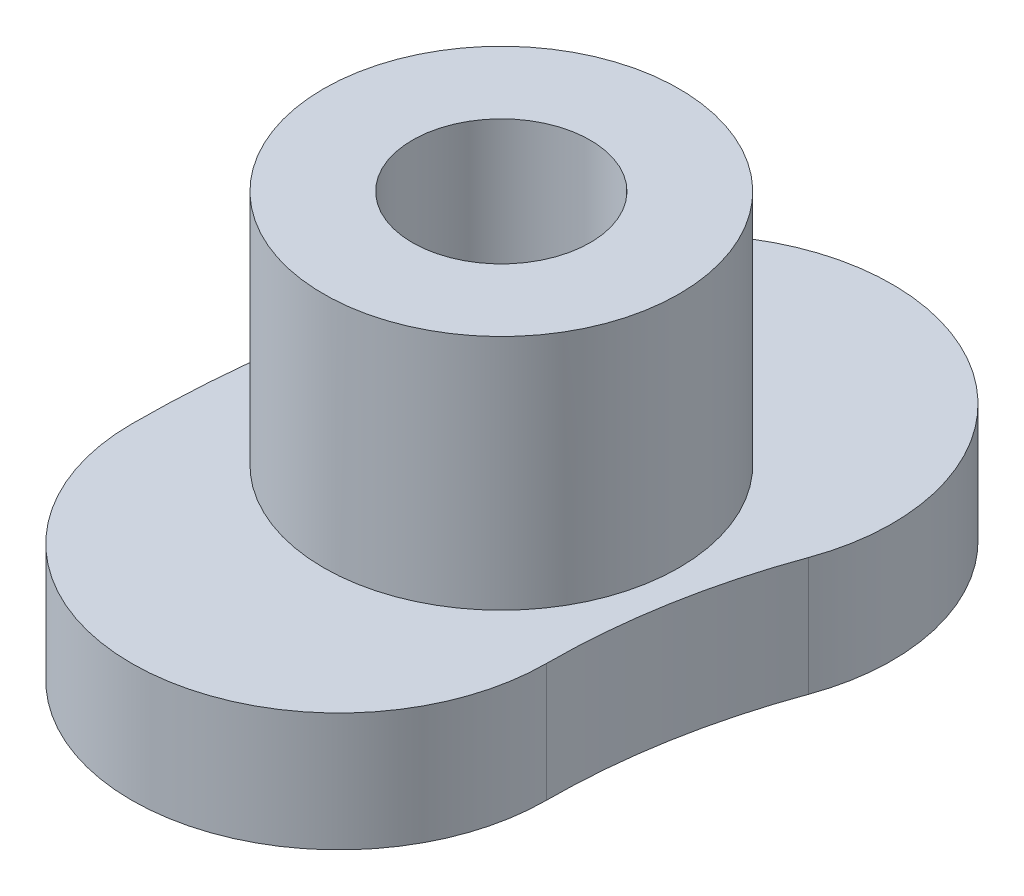
ISO-10303-21;
HEADER;
FILE_DESCRIPTION(('STEP AP214'),'2;1');
FILE_NAME('part.step','',(''),(''),'','','');
FILE_SCHEMA(('AUTOMOTIVE_DESIGN { 1 0 10303 214 1 1 1 1 }'));
ENDSEC;
DATA;
#1=APPLICATION_CONTEXT('core data for automotive mechanical design processes');
#2=APPLICATION_PROTOCOL_DEFINITION('international standard','automotive_design',2000,#1);
#3=PRODUCT_CONTEXT('',#1,'mechanical');
#4=PRODUCT('Part','Part','',(#3));
#5=PRODUCT_RELATED_PRODUCT_CATEGORY('part','',(#4));
#6=PRODUCT_DEFINITION_FORMATION('','',#4);
#7=PRODUCT_DEFINITION_CONTEXT('part definition',#1,'design');
#8=PRODUCT_DEFINITION('design','',#6,#7);
#9=PRODUCT_DEFINITION_SHAPE('','',#8);
#10=(LENGTH_UNIT() NAMED_UNIT(*) SI_UNIT(.MILLI.,.METRE.));
#11=(NAMED_UNIT(*) PLANE_ANGLE_UNIT() SI_UNIT($,.RADIAN.));
#12=(NAMED_UNIT(*) SI_UNIT($,.STERADIAN.) SOLID_ANGLE_UNIT());
#13=UNCERTAINTY_MEASURE_WITH_UNIT(LENGTH_MEASURE(1.E-05),#10,'distance_accuracy_value','');
#14=(GEOMETRIC_REPRESENTATION_CONTEXT(3) GLOBAL_UNCERTAINTY_ASSIGNED_CONTEXT((#13)) GLOBAL_UNIT_ASSIGNED_CONTEXT((#10,
#11,#12)) REPRESENTATION_CONTEXT('',''));
#15=CARTESIAN_POINT('',(0.,0.,0.));
#16=DIRECTION('',(0.,0.,1.));
#17=DIRECTION('',(1.,0.,0.));
#18=AXIS2_PLACEMENT_3D('',#15,#16,#17);
#19=CARTESIAN_POINT('',(0.,2.,0.));
#20=DIRECTION('',(0.,1.,0.));
#21=DIRECTION('',(0.,0.,1.));
#22=AXIS2_PLACEMENT_3D('',#19,#20,#21);
#23=PLANE('',#22);
#24=CARTESIAN_POINT('',(0.,2.,0.));
#25=DIRECTION('',(0.,1.,0.));
#26=DIRECTION('',(0.,0.,1.));
#27=AXIS2_PLACEMENT_3D('',#24,#25,#26);
#28=CIRCLE('',#27,18.);
#29=CARTESIAN_POINT('',(-16.9144671741464,2.,-6.15636257986194));
#30=VERTEX_POINT('',#29);
#31=CARTESIAN_POINT('',(-18.,2.,0.));
#32=VERTEX_POINT('',#31);
#33=EDGE_CURVE('E93',#30,#32,#28,.T.);
#34=ORIENTED_EDGE('',*,*,#33,.T.);
#35=CARTESIAN_POINT('',(-14.5,2.,0.));
#36=DIRECTION('',(0.,1.,0.));
#37=DIRECTION('',(0.,0.,1.));
#38=AXIS2_PLACEMENT_3D('',#35,#36,#37);
#39=CIRCLE('',#38,3.5);
#40=CARTESIAN_POINT('',(-11.,2.,0.));
#41=VERTEX_POINT('',#40);
#42=EDGE_CURVE('E88',#32,#41,#39,.T.);
#43=ORIENTED_EDGE('',*,*,#42,.T.);
#44=CARTESIAN_POINT('',(0.,2.,0.));
#45=DIRECTION('',(0.,1.,0.));
#46=DIRECTION('',(0.,0.,1.));
#47=AXIS2_PLACEMENT_3D('',#44,#45,#46);
#48=CIRCLE('',#47,11.);
#49=CARTESIAN_POINT('',(-10.336618828645,2.,-3.7622215765823));
#50=VERTEX_POINT('',#49);
#51=EDGE_CURVE('E91',#50,#41,#48,.T.);
#52=ORIENTED_EDGE('',*,*,#51,.F.);
#53=CARTESIAN_POINT('',(-13.6255430013957,2.,-4.95929207822211));
#54=DIRECTION('',(0.,1.,0.));
#55=DIRECTION('',(0.,0.,1.));
#56=AXIS2_PLACEMENT_3D('',#53,#54,#55);
#57=CIRCLE('',#56,3.5);
#58=EDGE_CURVE('E62',#50,#30,#57,.T.);
#59=ORIENTED_EDGE('',*,*,#58,.T.);
#60=EDGE_LOOP('',(#34,#43,#52,#59));
#61=FACE_BOUND('',#60,.T.);
#62=CARTESIAN_POINT('',(-14.279712418677,2.,-2.51789857617045));
#63=DIRECTION('',(0.,1.,0.));
#64=DIRECTION('',(0.,0.,1.));
#65=AXIS2_PLACEMENT_3D('',#62,#63,#64);
#66=CIRCLE('',#65,3.);
#67=CARTESIAN_POINT('',(-14.279712418677,2.,0.482101423829553));
#68=VERTEX_POINT('',#67);
#69=EDGE_CURVE('E112',#68,#68,#66,.F.);
#70=ORIENTED_EDGE('',*,*,#69,.T.);
#71=EDGE_LOOP('',(#70));
#72=FACE_BOUND('',#71,.T.);
#73=ADVANCED_FACE('F45',(#61,#72),#23,.T.);
#74=CARTESIAN_POINT('',(0.,2.,0.));
#75=DIRECTION('',(0.,-1.,0.));
#76=DIRECTION('',(0.,0.,-1.));
#77=AXIS2_PLACEMENT_3D('',#74,#75,#76);
#78=CYLINDRICAL_SURFACE('',#77,18.);
#79=CARTESIAN_POINT('',(0.,0.,0.));
#80=DIRECTION('',(0.,1.,0.));
#81=DIRECTION('',(0.,0.,1.));
#82=AXIS2_PLACEMENT_3D('',#79,#80,#81);
#83=CIRCLE('',#82,18.);
#84=CARTESIAN_POINT('',(-16.9144671741464,0.,-6.15636257986194));
#85=VERTEX_POINT('',#84);
#86=CARTESIAN_POINT('',(-18.,0.,0.));
#87=VERTEX_POINT('',#86);
#88=EDGE_CURVE('E111',#85,#87,#83,.T.);
#89=ORIENTED_EDGE('',*,*,#88,.T.);
#90=DIRECTION('',(0.,-1.,0.));
#91=VECTOR('',#90,1.);
#92=CARTESIAN_POINT('',(-18.,2.,0.));
#93=LINE('',#92,#91);
#94=EDGE_CURVE('E12',#32,#87,#93,.T.);
#95=ORIENTED_EDGE('',*,*,#94,.F.);
#96=ORIENTED_EDGE('',*,*,#33,.F.);
#97=DIRECTION('',(0.,-1.,0.));
#98=VECTOR('',#97,1.);
#99=CARTESIAN_POINT('',(-16.9144671741464,2.,-6.15636257986194));
#100=LINE('',#99,#98);
#101=EDGE_CURVE('E104',#30,#85,#100,.T.);
#102=ORIENTED_EDGE('',*,*,#101,.T.);
#103=EDGE_LOOP('',(#89,#95,#96,#102));
#104=FACE_BOUND('',#103,.T.);
#105=ADVANCED_FACE('F122',(#104),#78,.T.);
#106=CARTESIAN_POINT('',(-14.5,2.,0.));
#107=DIRECTION('',(0.,-1.,0.));
#108=DIRECTION('',(0.,0.,-1.));
#109=AXIS2_PLACEMENT_3D('',#106,#107,#108);
#110=CYLINDRICAL_SURFACE('',#109,3.5);
#111=CARTESIAN_POINT('',(-14.5,0.,0.));
#112=DIRECTION('',(0.,1.,0.));
#113=DIRECTION('',(0.,0.,1.));
#114=AXIS2_PLACEMENT_3D('',#111,#112,#113);
#115=CIRCLE('',#114,3.5);
#116=CARTESIAN_POINT('',(-11.,0.,0.));
#117=VERTEX_POINT('',#116);
#118=EDGE_CURVE('E98',#87,#117,#115,.T.);
#119=ORIENTED_EDGE('',*,*,#118,.T.);
#120=DIRECTION('',(0.,-1.,0.));
#121=VECTOR('',#120,1.);
#122=CARTESIAN_POINT('',(-11.,2.,0.));
#123=LINE('',#122,#121);
#124=EDGE_CURVE('E54',#41,#117,#123,.T.);
#125=ORIENTED_EDGE('',*,*,#124,.F.);
#126=ORIENTED_EDGE('',*,*,#42,.F.);
#127=ORIENTED_EDGE('',*,*,#94,.T.);
#128=EDGE_LOOP('',(#119,#125,#126,#127));
#129=FACE_BOUND('',#128,.T.);
#130=ADVANCED_FACE('F97',(#129),#110,.T.);
#131=CARTESIAN_POINT('',(0.,2.,0.));
#132=DIRECTION('',(0.,-1.,0.));
#133=DIRECTION('',(0.,0.,-1.));
#134=AXIS2_PLACEMENT_3D('',#131,#132,#133);
#135=CYLINDRICAL_SURFACE('',#134,11.);
#136=CARTESIAN_POINT('',(0.,0.,0.));
#137=DIRECTION('',(0.,1.,0.));
#138=DIRECTION('',(0.,0.,1.));
#139=AXIS2_PLACEMENT_3D('',#136,#137,#138);
#140=CIRCLE('',#139,11.);
#141=CARTESIAN_POINT('',(-10.336618828645,0.,-3.7622215765823));
#142=VERTEX_POINT('',#141);
#143=EDGE_CURVE('E116',#142,#117,#140,.T.);
#144=ORIENTED_EDGE('',*,*,#143,.F.);
#145=DIRECTION('',(0.,-1.,0.));
#146=VECTOR('',#145,1.);
#147=CARTESIAN_POINT('',(-10.336618828645,2.,-3.7622215765823));
#148=LINE('',#147,#146);
#149=EDGE_CURVE('E78',#50,#142,#148,.T.);
#150=ORIENTED_EDGE('',*,*,#149,.F.);
#151=ORIENTED_EDGE('',*,*,#51,.T.);
#152=ORIENTED_EDGE('',*,*,#124,.T.);
#153=EDGE_LOOP('',(#144,#150,#151,#152));
#154=FACE_BOUND('',#153,.T.);
#155=ADVANCED_FACE('F102',(#154),#135,.F.);
#156=CARTESIAN_POINT('',(-14.279712418677,2.,-2.51789857617045));
#157=DIRECTION('',(0.,-1.,0.));
#158=DIRECTION('',(0.,0.,-1.));
#159=AXIS2_PLACEMENT_3D('',#156,#157,#158);
#160=CYLINDRICAL_SURFACE('',#159,1.5);
#161=CARTESIAN_POINT('',(-14.279712418677,0.,-2.51789857617045));
#162=DIRECTION('',(0.,1.,0.));
#163=DIRECTION('',(0.,0.,1.));
#164=AXIS2_PLACEMENT_3D('',#161,#162,#163);
#165=CIRCLE('',#164,1.5);
#166=CARTESIAN_POINT('',(-14.279712418677,0.,-1.01789857617045));
#167=VERTEX_POINT('',#166);
#168=EDGE_CURVE('E108',#167,#167,#165,.T.);
#169=ORIENTED_EDGE('',*,*,#168,.F.);
#170=EDGE_LOOP('',(#169));
#171=FACE_BOUND('',#170,.T.);
#172=CARTESIAN_POINT('',(-14.279712418677,6.,-2.51789857617045));
#173=DIRECTION('',(0.,1.,0.));
#174=DIRECTION('',(0.,0.,1.));
#175=AXIS2_PLACEMENT_3D('',#172,#173,#174);
#176=CIRCLE('',#175,1.5);
#177=CARTESIAN_POINT('',(-14.279712418677,6.,-1.01789857617045));
#178=VERTEX_POINT('',#177);
#179=EDGE_CURVE('E154',#178,#178,#176,.T.);
#180=ORIENTED_EDGE('',*,*,#179,.T.);
#181=EDGE_LOOP('',(#180));
#182=FACE_BOUND('',#181,.T.);
#183=ADVANCED_FACE('F47',(#171,#182),#160,.F.);
#184=CARTESIAN_POINT('',(-13.6255430013957,2.,-4.95929207822211));
#185=DIRECTION('',(0.,-1.,0.));
#186=DIRECTION('',(0.,0.,-1.));
#187=AXIS2_PLACEMENT_3D('',#184,#185,#186);
#188=CYLINDRICAL_SURFACE('',#187,3.5);
#189=CARTESIAN_POINT('',(-13.6255430013957,0.,-4.95929207822211));
#190=DIRECTION('',(0.,1.,0.));
#191=DIRECTION('',(0.,0.,1.));
#192=AXIS2_PLACEMENT_3D('',#189,#190,#191);
#193=CIRCLE('',#192,3.5);
#194=EDGE_CURVE('E81',#142,#85,#193,.T.);
#195=ORIENTED_EDGE('',*,*,#194,.T.);
#196=ORIENTED_EDGE('',*,*,#101,.F.);
#197=ORIENTED_EDGE('',*,*,#58,.F.);
#198=ORIENTED_EDGE('',*,*,#149,.T.);
#199=EDGE_LOOP('',(#195,#196,#197,#198));
#200=FACE_BOUND('',#199,.T.);
#201=ADVANCED_FACE('F127',(#200),#188,.T.);
#202=CARTESIAN_POINT('',(0.,0.,0.));
#203=DIRECTION('',(0.,1.,0.));
#204=DIRECTION('',(0.,0.,1.));
#205=AXIS2_PLACEMENT_3D('',#202,#203,#204);
#206=PLANE('',#205);
#207=ORIENTED_EDGE('',*,*,#168,.T.);
#208=EDGE_LOOP('',(#207));
#209=FACE_BOUND('',#208,.T.);
#210=ORIENTED_EDGE('',*,*,#88,.F.);
#211=ORIENTED_EDGE('',*,*,#194,.F.);
#212=ORIENTED_EDGE('',*,*,#143,.T.);
#213=ORIENTED_EDGE('',*,*,#118,.F.);
#214=EDGE_LOOP('',(#210,#211,#212,#213));
#215=FACE_BOUND('',#214,.T.);
#216=ADVANCED_FACE('F124',(#209,#215),#206,.F.);
#217=CARTESIAN_POINT('',(-14.279712418677,6.,-2.51789857617045));
#218=DIRECTION('',(0.,1.,0.));
#219=DIRECTION('',(0.,0.,1.));
#220=AXIS2_PLACEMENT_3D('',#217,#218,#219);
#221=PLANE('',#220);
#222=CARTESIAN_POINT('',(-14.279712418677,6.,-2.51789857617045));
#223=DIRECTION('',(0.,1.,0.));
#224=DIRECTION('',(1.,0.,0.));
#225=AXIS2_PLACEMENT_3D('',#222,#223,#224);
#226=CIRCLE('',#225,3.);
#227=CARTESIAN_POINT('',(-11.279712418677,6.,-2.51789857617045));
#228=VERTEX_POINT('',#227);
#229=EDGE_CURVE('E153',#228,#228,#226,.T.);
#230=ORIENTED_EDGE('',*,*,#229,.T.);
#231=EDGE_LOOP('',(#230));
#232=FACE_BOUND('',#231,.T.);
#233=ORIENTED_EDGE('',*,*,#179,.F.);
#234=EDGE_LOOP('',(#233));
#235=FACE_BOUND('',#234,.T.);
#236=ADVANCED_FACE('F126',(#232,#235),#221,.T.);
#237=CARTESIAN_POINT('',(-14.279712418677,6.,-2.51789857617045));
#238=DIRECTION('',(0.,-1.,0.));
#239=DIRECTION('',(0.,0.,-1.));
#240=AXIS2_PLACEMENT_3D('',#237,#238,#239);
#241=CYLINDRICAL_SURFACE('',#240,3.);
#242=ORIENTED_EDGE('',*,*,#69,.F.);
#243=EDGE_LOOP('',(#242));
#244=FACE_BOUND('',#243,.T.);
#245=ORIENTED_EDGE('',*,*,#229,.F.);
#246=EDGE_LOOP('',(#245));
#247=FACE_BOUND('',#246,.T.);
#248=ADVANCED_FACE('F134',(#244,#247),#241,.T.);
#249=CLOSED_SHELL('',(#73,#105,#130,#155,#183,#201,#216,#236,#248));
#250=MANIFOLD_SOLID_BREP('B2',#249);
#251=ADVANCED_BREP_SHAPE_REPRESENTATION('',(#18,#250),#14);
#252=SHAPE_DEFINITION_REPRESENTATION(#9,#251);
ENDSEC;
END-ISO-10303-21;
